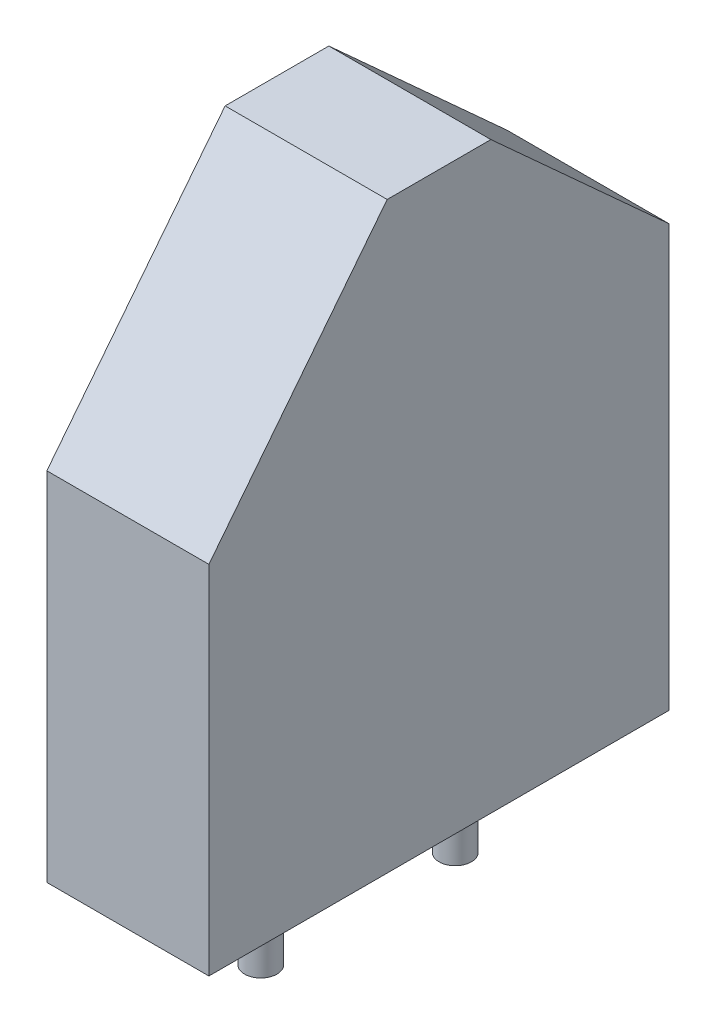
ISO-10303-21;
HEADER;
FILE_DESCRIPTION(('STEP AP214'),'2;1');
FILE_NAME('part.step','',(''),(''),'','','');
FILE_SCHEMA(('AUTOMOTIVE_DESIGN { 1 0 10303 214 1 1 1 1 }'));
ENDSEC;
DATA;
#1=APPLICATION_CONTEXT('core data for automotive mechanical design processes');
#2=APPLICATION_PROTOCOL_DEFINITION('international standard','automotive_design',2000,#1);
#3=PRODUCT_CONTEXT('',#1,'mechanical');
#4=PRODUCT('Part','Part','',(#3));
#5=PRODUCT_RELATED_PRODUCT_CATEGORY('part','',(#4));
#6=PRODUCT_DEFINITION_FORMATION('','',#4);
#7=PRODUCT_DEFINITION_CONTEXT('part definition',#1,'design');
#8=PRODUCT_DEFINITION('design','',#6,#7);
#9=PRODUCT_DEFINITION_SHAPE('','',#8);
#10=(LENGTH_UNIT() NAMED_UNIT(*) SI_UNIT(.MILLI.,.METRE.));
#11=(NAMED_UNIT(*) PLANE_ANGLE_UNIT() SI_UNIT($,.RADIAN.));
#12=(NAMED_UNIT(*) SI_UNIT($,.STERADIAN.) SOLID_ANGLE_UNIT());
#13=UNCERTAINTY_MEASURE_WITH_UNIT(LENGTH_MEASURE(1.E-05),#10,'distance_accuracy_value','');
#14=(GEOMETRIC_REPRESENTATION_CONTEXT(3) GLOBAL_UNCERTAINTY_ASSIGNED_CONTEXT((#13)) GLOBAL_UNIT_ASSIGNED_CONTEXT((#10,
#11,#12)) REPRESENTATION_CONTEXT('',''));
#15=CARTESIAN_POINT('',(0.,0.,0.));
#16=DIRECTION('',(0.,0.,1.));
#17=DIRECTION('',(1.,0.,0.));
#18=AXIS2_PLACEMENT_3D('',#15,#16,#17);
#19=CARTESIAN_POINT('',(-2.5,0.,7.09999999999999));
#20=DIRECTION('',(0.,1.,0.));
#21=DIRECTION('',(0.,0.,1.));
#22=AXIS2_PLACEMENT_3D('',#19,#20,#21);
#23=PLANE('',#22);
#24=CARTESIAN_POINT('',(0.,0.,3.));
#25=DIRECTION('',(0.,1.,0.));
#26=DIRECTION('',(0.,0.,1.));
#27=AXIS2_PLACEMENT_3D('',#24,#25,#26);
#28=CIRCLE('',#27,0.5);
#29=CARTESIAN_POINT('',(0.,0.,3.5));
#30=VERTEX_POINT('',#29);
#31=EDGE_CURVE('E43',#30,#30,#28,.F.);
#32=ORIENTED_EDGE('',*,*,#31,.F.);
#33=EDGE_LOOP('',(#32));
#34=FACE_BOUND('',#33,.T.);
#35=DIRECTION('',(0.,0.,1.));
#36=VECTOR('',#35,1.);
#37=CARTESIAN_POINT('',(-2.5,0.,-7.09999999999999));
#38=LINE('',#37,#36);
#39=CARTESIAN_POINT('',(-2.5,0.,-7.09999999999999));
#40=VERTEX_POINT('',#39);
#41=CARTESIAN_POINT('',(-2.5,0.,7.09999999999999));
#42=VERTEX_POINT('',#41);
#43=EDGE_CURVE('E131',#40,#42,#38,.T.);
#44=ORIENTED_EDGE('',*,*,#43,.F.);
#45=DIRECTION('',(-1.,0.,0.));
#46=VECTOR('',#45,1.);
#47=CARTESIAN_POINT('',(-2.5,0.,-7.09999999999999));
#48=LINE('',#47,#46);
#49=CARTESIAN_POINT('',(2.50000000000001,0.,-7.09999999999999));
#50=VERTEX_POINT('',#49);
#51=EDGE_CURVE('E110',#50,#40,#48,.T.);
#52=ORIENTED_EDGE('',*,*,#51,.F.);
#53=DIRECTION('',(0.,0.,-1.));
#54=VECTOR('',#53,1.);
#55=CARTESIAN_POINT('',(2.50000000000001,0.,-7.09999999999999));
#56=LINE('',#55,#54);
#57=CARTESIAN_POINT('',(2.50000000000001,0.,7.09999999999999));
#58=VERTEX_POINT('',#57);
#59=EDGE_CURVE('E176',#58,#50,#56,.T.);
#60=ORIENTED_EDGE('',*,*,#59,.F.);
#61=DIRECTION('',(1.,0.,0.));
#62=VECTOR('',#61,1.);
#63=CARTESIAN_POINT('',(-2.5,0.,7.09999999999999));
#64=LINE('',#63,#62);
#65=EDGE_CURVE('E174',#42,#58,#64,.T.);
#66=ORIENTED_EDGE('',*,*,#65,.F.);
#67=EDGE_LOOP('',(#44,#52,#60,#66));
#68=FACE_BOUND('',#67,.T.);
#69=CARTESIAN_POINT('',(0.,0.,-3.));
#70=DIRECTION('',(0.,1.,0.));
#71=DIRECTION('',(0.,0.,1.));
#72=AXIS2_PLACEMENT_3D('',#69,#70,#71);
#73=CIRCLE('',#72,0.5);
#74=CARTESIAN_POINT('',(0.,0.,-2.5));
#75=VERTEX_POINT('',#74);
#76=EDGE_CURVE('E11',#75,#75,#73,.F.);
#77=ORIENTED_EDGE('',*,*,#76,.F.);
#78=EDGE_LOOP('',(#77));
#79=FACE_BOUND('',#78,.T.);
#80=ADVANCED_FACE('F35',(#34,#68,#79),#23,.F.);
#81=CARTESIAN_POINT('',(-2.5,18.,-7.09999999999999));
#82=DIRECTION('',(1.,0.,0.));
#83=DIRECTION('',(0.,0.,-1.));
#84=AXIS2_PLACEMENT_3D('',#81,#82,#83);
#85=PLANE('',#84);
#86=DIRECTION('',(0.,0.,1.));
#87=VECTOR('',#86,1.);
#88=CARTESIAN_POINT('',(-2.5,18.,-7.09999999999999));
#89=LINE('',#88,#87);
#90=CARTESIAN_POINT('',(-2.5,18.,-1.6));
#91=VERTEX_POINT('',#90);
#92=CARTESIAN_POINT('',(-2.49999999999999,18.,1.6));
#93=VERTEX_POINT('',#92);
#94=EDGE_CURVE('E107',#91,#93,#89,.T.);
#95=ORIENTED_EDGE('',*,*,#94,.F.);
#96=DIRECTION('',(0.,-0.672672793996313,-0.739940073395943));
#97=VECTOR('',#96,1.);
#98=CARTESIAN_POINT('',(-2.49999999999999,18.,-1.6));
#99=LINE('',#98,#97);
#100=CARTESIAN_POINT('',(-2.49999999999999,13.,-7.09999999999999));
#101=VERTEX_POINT('',#100);
#102=EDGE_CURVE('E50',#91,#101,#99,.T.);
#103=ORIENTED_EDGE('',*,*,#102,.T.);
#104=DIRECTION('',(0.,-1.,0.));
#105=VECTOR('',#104,1.);
#106=CARTESIAN_POINT('',(-2.5,18.,-7.09999999999999));
#107=LINE('',#106,#105);
#108=EDGE_CURVE('E106',#101,#40,#107,.T.);
#109=ORIENTED_EDGE('',*,*,#108,.T.);
#110=ORIENTED_EDGE('',*,*,#43,.T.);
#111=DIRECTION('',(0.,-1.,0.));
#112=VECTOR('',#111,1.);
#113=CARTESIAN_POINT('',(-2.5,18.,7.09999999999999));
#114=LINE('',#113,#112);
#115=CARTESIAN_POINT('',(-2.49999999999999,11.,7.09999999999999));
#116=VERTEX_POINT('',#115);
#117=EDGE_CURVE('E117',#116,#42,#114,.T.);
#118=ORIENTED_EDGE('',*,*,#117,.F.);
#119=DIRECTION('',(0.,0.786318338822423,-0.617821551931903));
#120=VECTOR('',#119,1.);
#121=CARTESIAN_POINT('',(-2.49999999999999,18.,1.6));
#122=LINE('',#121,#120);
#123=EDGE_CURVE('E177',#116,#93,#122,.T.);
#124=ORIENTED_EDGE('',*,*,#123,.T.);
#125=EDGE_LOOP('',(#95,#103,#109,#110,#118,#124));
#126=FACE_BOUND('',#125,.T.);
#127=ADVANCED_FACE('F37',(#126),#85,.F.);
#128=CARTESIAN_POINT('',(-2.5,18.,7.09999999999999));
#129=DIRECTION('',(0.,0.,-1.));
#130=DIRECTION('',(-1.,0.,0.));
#131=AXIS2_PLACEMENT_3D('',#128,#129,#130);
#132=PLANE('',#131);
#133=DIRECTION('',(0.,-1.,0.));
#134=VECTOR('',#133,1.);
#135=CARTESIAN_POINT('',(2.50000000000001,18.,7.09999999999999));
#136=LINE('',#135,#134);
#137=CARTESIAN_POINT('',(2.50000000000001,11.,7.09999999999999));
#138=VERTEX_POINT('',#137);
#139=EDGE_CURVE('E115',#138,#58,#136,.T.);
#140=ORIENTED_EDGE('',*,*,#139,.F.);
#141=DIRECTION('',(1.,0.,0.));
#142=VECTOR('',#141,1.);
#143=CARTESIAN_POINT('',(-2.49999999999999,11.,7.09999999999999));
#144=LINE('',#143,#142);
#145=EDGE_CURVE('E172',#116,#138,#144,.T.);
#146=ORIENTED_EDGE('',*,*,#145,.F.);
#147=ORIENTED_EDGE('',*,*,#117,.T.);
#148=ORIENTED_EDGE('',*,*,#65,.T.);
#149=EDGE_LOOP('',(#140,#146,#147,#148));
#150=FACE_BOUND('',#149,.T.);
#151=ADVANCED_FACE('F162',(#150),#132,.F.);
#152=CARTESIAN_POINT('',(2.50000000000001,18.,-7.09999999999999));
#153=DIRECTION('',(-1.,0.,0.));
#154=DIRECTION('',(0.,0.,1.));
#155=AXIS2_PLACEMENT_3D('',#152,#153,#154);
#156=PLANE('',#155);
#157=DIRECTION('',(0.,-1.,0.));
#158=VECTOR('',#157,1.);
#159=CARTESIAN_POINT('',(2.50000000000001,18.,-7.09999999999999));
#160=LINE('',#159,#158);
#161=CARTESIAN_POINT('',(2.50000000000001,13.,-7.09999999999999));
#162=VERTEX_POINT('',#161);
#163=EDGE_CURVE('E102',#162,#50,#160,.T.);
#164=ORIENTED_EDGE('',*,*,#163,.F.);
#165=DIRECTION('',(0.,-0.672672793996313,-0.739940073395943));
#166=VECTOR('',#165,1.);
#167=CARTESIAN_POINT('',(2.50000000000001,18.,-1.6));
#168=LINE('',#167,#166);
#169=CARTESIAN_POINT('',(2.50000000000001,18.,-1.6));
#170=VERTEX_POINT('',#169);
#171=EDGE_CURVE('E89',#170,#162,#168,.T.);
#172=ORIENTED_EDGE('',*,*,#171,.F.);
#173=DIRECTION('',(0.,0.,-1.));
#174=VECTOR('',#173,1.);
#175=CARTESIAN_POINT('',(2.50000000000001,18.,-7.09999999999999));
#176=LINE('',#175,#174);
#177=CARTESIAN_POINT('',(2.50000000000001,18.,1.6));
#178=VERTEX_POINT('',#177);
#179=EDGE_CURVE('E100',#178,#170,#176,.T.);
#180=ORIENTED_EDGE('',*,*,#179,.F.);
#181=DIRECTION('',(0.,0.786318338822423,-0.617821551931903));
#182=VECTOR('',#181,1.);
#183=CARTESIAN_POINT('',(2.50000000000001,18.,1.6));
#184=LINE('',#183,#182);
#185=EDGE_CURVE('E58',#138,#178,#184,.T.);
#186=ORIENTED_EDGE('',*,*,#185,.F.);
#187=ORIENTED_EDGE('',*,*,#139,.T.);
#188=ORIENTED_EDGE('',*,*,#59,.T.);
#189=EDGE_LOOP('',(#164,#172,#180,#186,#187,#188));
#190=FACE_BOUND('',#189,.T.);
#191=ADVANCED_FACE('F99',(#190),#156,.F.);
#192=CARTESIAN_POINT('',(-2.5,18.,-7.09999999999999));
#193=DIRECTION('',(0.,0.,1.));
#194=DIRECTION('',(1.,0.,0.));
#195=AXIS2_PLACEMENT_3D('',#192,#193,#194);
#196=PLANE('',#195);
#197=ORIENTED_EDGE('',*,*,#108,.F.);
#198=DIRECTION('',(1.,0.,0.));
#199=VECTOR('',#198,1.);
#200=CARTESIAN_POINT('',(-2.49999999999999,13.,-7.09999999999999));
#201=LINE('',#200,#199);
#202=EDGE_CURVE('E94',#101,#162,#201,.T.);
#203=ORIENTED_EDGE('',*,*,#202,.T.);
#204=ORIENTED_EDGE('',*,*,#163,.T.);
#205=ORIENTED_EDGE('',*,*,#51,.T.);
#206=EDGE_LOOP('',(#197,#203,#204,#205));
#207=FACE_BOUND('',#206,.T.);
#208=ADVANCED_FACE('F157',(#207),#196,.F.);
#209=CARTESIAN_POINT('',(-2.5,18.,7.09999999999999));
#210=DIRECTION('',(0.,1.,0.));
#211=DIRECTION('',(0.,0.,1.));
#212=AXIS2_PLACEMENT_3D('',#209,#210,#211);
#213=PLANE('',#212);
#214=DIRECTION('',(1.,0.,0.));
#215=VECTOR('',#214,1.);
#216=CARTESIAN_POINT('',(-2.49999999999999,18.,-1.6));
#217=LINE('',#216,#215);
#218=EDGE_CURVE('E86',#91,#170,#217,.T.);
#219=ORIENTED_EDGE('',*,*,#218,.F.);
#220=ORIENTED_EDGE('',*,*,#94,.T.);
#221=DIRECTION('',(1.,0.,0.));
#222=VECTOR('',#221,1.);
#223=CARTESIAN_POINT('',(-2.49999999999999,18.,1.6));
#224=LINE('',#223,#222);
#225=EDGE_CURVE('E105',#93,#178,#224,.T.);
#226=ORIENTED_EDGE('',*,*,#225,.T.);
#227=ORIENTED_EDGE('',*,*,#179,.T.);
#228=EDGE_LOOP('',(#219,#220,#226,#227));
#229=FACE_BOUND('',#228,.T.);
#230=ADVANCED_FACE('F104',(#229),#213,.T.);
#231=CARTESIAN_POINT('',(0.,-3.,3.));
#232=DIRECTION('',(0.,1.,0.));
#233=DIRECTION('',(0.,0.,1.));
#234=AXIS2_PLACEMENT_3D('',#231,#232,#233);
#235=CYLINDRICAL_SURFACE('',#234,0.5);
#236=CARTESIAN_POINT('',(0.,-3.,3.));
#237=DIRECTION('',(0.,-1.,0.));
#238=DIRECTION('',(0.,0.,-1.));
#239=AXIS2_PLACEMENT_3D('',#236,#237,#238);
#240=CIRCLE('',#239,0.5);
#241=CARTESIAN_POINT('',(0.,-3.,2.5));
#242=VERTEX_POINT('',#241);
#243=EDGE_CURVE('E188',#242,#242,#240,.T.);
#244=ORIENTED_EDGE('',*,*,#243,.F.);
#245=EDGE_LOOP('',(#244));
#246=FACE_BOUND('',#245,.T.);
#247=ORIENTED_EDGE('',*,*,#31,.T.);
#248=EDGE_LOOP('',(#247));
#249=FACE_BOUND('',#248,.T.);
#250=ADVANCED_FACE('F121',(#246,#249),#235,.T.);
#251=CARTESIAN_POINT('',(0.,-3.,3.));
#252=DIRECTION('',(0.,-1.,0.));
#253=DIRECTION('',(0.,0.,-1.));
#254=AXIS2_PLACEMENT_3D('',#251,#252,#253);
#255=PLANE('',#254);
#256=ORIENTED_EDGE('',*,*,#243,.T.);
#257=EDGE_LOOP('',(#256));
#258=FACE_BOUND('',#257,.T.);
#259=ADVANCED_FACE('F137',(#258),#255,.T.);
#260=CARTESIAN_POINT('',(0.,-3.,-3.));
#261=DIRECTION('',(0.,1.,0.));
#262=DIRECTION('',(0.,0.,1.));
#263=AXIS2_PLACEMENT_3D('',#260,#261,#262);
#264=CYLINDRICAL_SURFACE('',#263,0.5);
#265=CARTESIAN_POINT('',(0.,-3.,-3.));
#266=DIRECTION('',(0.,-1.,0.));
#267=DIRECTION('',(0.,0.,-1.));
#268=AXIS2_PLACEMENT_3D('',#265,#266,#267);
#269=CIRCLE('',#268,0.5);
#270=CARTESIAN_POINT('',(0.,-3.,-3.5));
#271=VERTEX_POINT('',#270);
#272=EDGE_CURVE('E184',#271,#271,#269,.T.);
#273=ORIENTED_EDGE('',*,*,#272,.F.);
#274=EDGE_LOOP('',(#273));
#275=FACE_BOUND('',#274,.T.);
#276=ORIENTED_EDGE('',*,*,#76,.T.);
#277=EDGE_LOOP('',(#276));
#278=FACE_BOUND('',#277,.T.);
#279=ADVANCED_FACE('F134',(#275,#278),#264,.T.);
#280=CARTESIAN_POINT('',(0.,-3.,-3.));
#281=DIRECTION('',(0.,-1.,0.));
#282=DIRECTION('',(0.,0.,-1.));
#283=AXIS2_PLACEMENT_3D('',#280,#281,#282);
#284=PLANE('',#283);
#285=ORIENTED_EDGE('',*,*,#272,.T.);
#286=EDGE_LOOP('',(#285));
#287=FACE_BOUND('',#286,.T.);
#288=ADVANCED_FACE('F136',(#287),#284,.T.);
#289=CARTESIAN_POINT('',(-2.49999999999999,18.,1.6));
#290=DIRECTION('',(0.,-0.617821551931903,-0.786318338822423));
#291=DIRECTION('',(0.,0.786318338822423,-0.617821551931903));
#292=AXIS2_PLACEMENT_3D('',#289,#290,#291);
#293=PLANE('',#292);
#294=ORIENTED_EDGE('',*,*,#185,.T.);
#295=ORIENTED_EDGE('',*,*,#225,.F.);
#296=ORIENTED_EDGE('',*,*,#123,.F.);
#297=ORIENTED_EDGE('',*,*,#145,.T.);
#298=EDGE_LOOP('',(#294,#295,#296,#297));
#299=FACE_BOUND('',#298,.T.);
#300=ADVANCED_FACE('F144',(#299),#293,.F.);
#301=CARTESIAN_POINT('',(-2.49999999999999,18.,-1.6));
#302=DIRECTION('',(0.,-0.739940073395943,0.672672793996313));
#303=DIRECTION('',(0.,-0.672672793996313,-0.739940073395943));
#304=AXIS2_PLACEMENT_3D('',#301,#302,#303);
#305=PLANE('',#304);
#306=ORIENTED_EDGE('',*,*,#171,.T.);
#307=ORIENTED_EDGE('',*,*,#202,.F.);
#308=ORIENTED_EDGE('',*,*,#102,.F.);
#309=ORIENTED_EDGE('',*,*,#218,.T.);
#310=EDGE_LOOP('',(#306,#307,#308,#309));
#311=FACE_BOUND('',#310,.T.);
#312=ADVANCED_FACE('F88',(#311),#305,.F.);
#313=CLOSED_SHELL('',(#80,#127,#151,#191,#208,#230,#250,#259,#279,#288,#300,#312));
#314=MANIFOLD_SOLID_BREP('B2',#313);
#315=ADVANCED_BREP_SHAPE_REPRESENTATION('',(#18,#314),#14);
#316=SHAPE_DEFINITION_REPRESENTATION(#9,#315);
ENDSEC;
END-ISO-10303-21;
